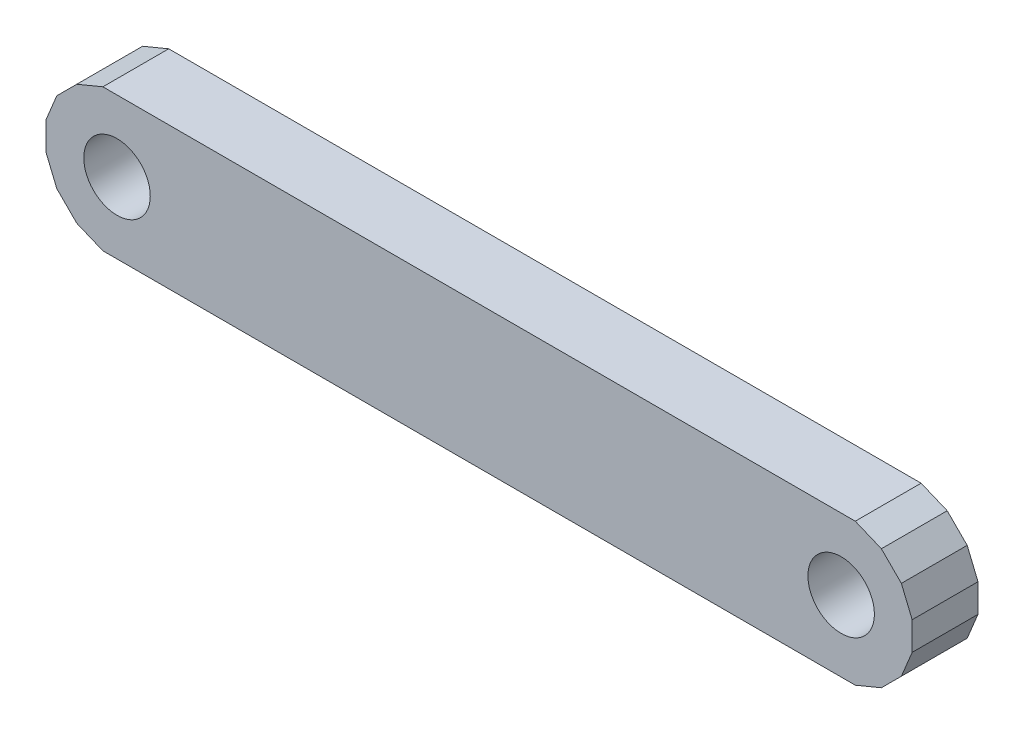
ISO-10303-21;
HEADER;
FILE_DESCRIPTION(('STEP AP214'),'2;1');
FILE_NAME('part.step','',(''),(''),'','','');
FILE_SCHEMA(('AUTOMOTIVE_DESIGN { 1 0 10303 214 1 1 1 1 }'));
ENDSEC;
DATA;
#1=APPLICATION_CONTEXT('core data for automotive mechanical design processes');
#2=APPLICATION_PROTOCOL_DEFINITION('international standard','automotive_design',2000,#1);
#3=PRODUCT_CONTEXT('',#1,'mechanical');
#4=PRODUCT('Part','Part','',(#3));
#5=PRODUCT_RELATED_PRODUCT_CATEGORY('part','',(#4));
#6=PRODUCT_DEFINITION_FORMATION('','',#4);
#7=PRODUCT_DEFINITION_CONTEXT('part definition',#1,'design');
#8=PRODUCT_DEFINITION('design','',#6,#7);
#9=PRODUCT_DEFINITION_SHAPE('','',#8);
#10=(LENGTH_UNIT() NAMED_UNIT(*) SI_UNIT(.MILLI.,.METRE.));
#11=(NAMED_UNIT(*) PLANE_ANGLE_UNIT() SI_UNIT($,.RADIAN.));
#12=(NAMED_UNIT(*) SI_UNIT($,.STERADIAN.) SOLID_ANGLE_UNIT());
#13=UNCERTAINTY_MEASURE_WITH_UNIT(LENGTH_MEASURE(1.E-05),#10,'distance_accuracy_value','');
#14=(GEOMETRIC_REPRESENTATION_CONTEXT(3) GLOBAL_UNCERTAINTY_ASSIGNED_CONTEXT((#13)) GLOBAL_UNIT_ASSIGNED_CONTEXT((#10,
#11,#12)) REPRESENTATION_CONTEXT('',''));
#15=CARTESIAN_POINT('',(0.,0.,0.));
#16=DIRECTION('',(0.,0.,1.));
#17=DIRECTION('',(1.,0.,0.));
#18=AXIS2_PLACEMENT_3D('',#15,#16,#17);
#19=CARTESIAN_POINT('',(0.,0.,18.));
#20=DIRECTION('',(0.,0.,1.));
#21=DIRECTION('',(1.,0.,0.));
#22=AXIS2_PLACEMENT_3D('',#19,#20,#21);
#23=PLANE('',#22);
#24=CARTESIAN_POINT('',(0.,0.,18.));
#25=DIRECTION('',(0.,0.,1.));
#26=DIRECTION('',(1.,0.,0.));
#27=AXIS2_PLACEMENT_3D('',#24,#25,#26);
#28=CIRCLE('',#27,5.05);
#29=CARTESIAN_POINT('',(5.05,0.,18.));
#30=VERTEX_POINT('',#29);
#31=EDGE_CURVE('E192',#30,#30,#28,.T.);
#32=ORIENTED_EDGE('',*,*,#31,.F.);
#33=EDGE_LOOP('',(#32));
#34=FACE_BOUND('',#33,.T.);
#35=DIRECTION('',(-0.382683432365089,0.923879532511287,0.));
#36=VECTOR('',#35,1.);
#37=CARTESIAN_POINT('',(10.7886380844355,2.14599354217741,18.));
#38=LINE('',#37,#36);
#39=CARTESIAN_POINT('',(10.7886380844355,2.14599354217741,18.));
#40=VERTEX_POINT('',#39);
#41=CARTESIAN_POINT('',(9.146165735328,6.11127256321562,18.));
#42=VERTEX_POINT('',#41);
#43=EDGE_CURVE('E219',#40,#42,#38,.T.);
#44=ORIENTED_EDGE('',*,*,#43,.T.);
#45=DIRECTION('',(-0.707106781186548,0.707106781186547,0.));
#46=VECTOR('',#45,1.);
#47=CARTESIAN_POINT('',(9.146165735328,6.11127256321562,18.));
#48=LINE('',#47,#46);
#49=CARTESIAN_POINT('',(6.11127256321562,9.146165735328,18.));
#50=VERTEX_POINT('',#49);
#51=EDGE_CURVE('E127',#42,#50,#48,.T.);
#52=ORIENTED_EDGE('',*,*,#51,.T.);
#53=DIRECTION('',(-0.923879532511287,0.38268343236509,0.));
#54=VECTOR('',#53,1.);
#55=CARTESIAN_POINT('',(6.11127256321562,9.146165735328,18.));
#56=LINE('',#55,#54);
#57=CARTESIAN_POINT('',(2.14599354217741,10.7886380844355,18.));
#58=VERTEX_POINT('',#57);
#59=EDGE_CURVE('E258',#50,#58,#56,.T.);
#60=ORIENTED_EDGE('',*,*,#59,.T.);
#61=DIRECTION('',(-1.,0.,0.));
#62=VECTOR('',#61,1.);
#63=CARTESIAN_POINT('',(2.14599354217741,10.7886380844355,18.));
#64=LINE('',#63,#62);
#65=CARTESIAN_POINT('',(-112.145993542177,10.7886380844355,18.));
#66=VERTEX_POINT('',#65);
#67=EDGE_CURVE('E277',#58,#66,#64,.T.);
#68=ORIENTED_EDGE('',*,*,#67,.T.);
#69=DIRECTION('',(-0.923879532511286,-0.382683432365091,0.));
#70=VECTOR('',#69,1.);
#71=CARTESIAN_POINT('',(-112.145993542177,10.7886380844355,18.));
#72=LINE('',#71,#70);
#73=CARTESIAN_POINT('',(-116.111272563216,9.146165735328,18.));
#74=VERTEX_POINT('',#73);
#75=EDGE_CURVE('E274',#66,#74,#72,.T.);
#76=ORIENTED_EDGE('',*,*,#75,.T.);
#77=DIRECTION('',(-0.707106781186548,-0.707106781186547,0.));
#78=VECTOR('',#77,1.);
#79=CARTESIAN_POINT('',(-116.111272563216,9.146165735328,18.));
#80=LINE('',#79,#78);
#81=CARTESIAN_POINT('',(-119.146165735328,6.11127256321562,18.));
#82=VERTEX_POINT('',#81);
#83=EDGE_CURVE('E276',#74,#82,#80,.T.);
#84=ORIENTED_EDGE('',*,*,#83,.T.);
#85=DIRECTION('',(-0.38268343236509,-0.923879532511286,0.));
#86=VECTOR('',#85,1.);
#87=CARTESIAN_POINT('',(-119.146165735328,6.11127256321562,18.));
#88=LINE('',#87,#86);
#89=CARTESIAN_POINT('',(-120.788638084436,2.14599354217741,18.));
#90=VERTEX_POINT('',#89);
#91=EDGE_CURVE('E279',#82,#90,#88,.T.);
#92=ORIENTED_EDGE('',*,*,#91,.T.);
#93=DIRECTION('',(0.,-1.,0.));
#94=VECTOR('',#93,1.);
#95=CARTESIAN_POINT('',(-120.788638084436,2.14599354217741,18.));
#96=LINE('',#95,#94);
#97=CARTESIAN_POINT('',(-120.788638084436,-2.14599354217742,18.));
#98=VERTEX_POINT('',#97);
#99=EDGE_CURVE('E285',#90,#98,#96,.T.);
#100=ORIENTED_EDGE('',*,*,#99,.T.);
#101=DIRECTION('',(0.382683432365091,-0.923879532511286,0.));
#102=VECTOR('',#101,1.);
#103=CARTESIAN_POINT('',(-120.788638084436,-2.14599354217742,18.));
#104=LINE('',#103,#102);
#105=CARTESIAN_POINT('',(-119.146165735328,-6.11127256321562,18.));
#106=VERTEX_POINT('',#105);
#107=EDGE_CURVE('E287',#98,#106,#104,.T.);
#108=ORIENTED_EDGE('',*,*,#107,.T.);
#109=DIRECTION('',(0.707106781186548,-0.707106781186547,0.));
#110=VECTOR('',#109,1.);
#111=CARTESIAN_POINT('',(-119.146165735328,-6.11127256321562,18.));
#112=LINE('',#111,#110);
#113=CARTESIAN_POINT('',(-116.111272563216,-9.146165735328,18.));
#114=VERTEX_POINT('',#113);
#115=EDGE_CURVE('E289',#106,#114,#112,.T.);
#116=ORIENTED_EDGE('',*,*,#115,.T.);
#117=DIRECTION('',(0.923879532511287,-0.38268343236509,0.));
#118=VECTOR('',#117,1.);
#119=CARTESIAN_POINT('',(-116.111272563216,-9.146165735328,18.));
#120=LINE('',#119,#118);
#121=CARTESIAN_POINT('',(-112.145993542177,-10.7886380844355,18.));
#122=VERTEX_POINT('',#121);
#123=EDGE_CURVE('E291',#114,#122,#120,.T.);
#124=ORIENTED_EDGE('',*,*,#123,.T.);
#125=DIRECTION('',(1.,0.,0.));
#126=VECTOR('',#125,1.);
#127=CARTESIAN_POINT('',(-112.145993542177,-10.7886380844355,18.));
#128=LINE('',#127,#126);
#129=CARTESIAN_POINT('',(2.14599354217742,-10.7886380844355,18.));
#130=VERTEX_POINT('',#129);
#131=EDGE_CURVE('E293',#122,#130,#128,.T.);
#132=ORIENTED_EDGE('',*,*,#131,.T.);
#133=DIRECTION('',(0.923879532511287,0.38268343236509,0.));
#134=VECTOR('',#133,1.);
#135=CARTESIAN_POINT('',(2.14599354217742,-10.7886380844355,18.));
#136=LINE('',#135,#134);
#137=CARTESIAN_POINT('',(6.11127256321562,-9.146165735328,18.));
#138=VERTEX_POINT('',#137);
#139=EDGE_CURVE('E170',#130,#138,#136,.T.);
#140=ORIENTED_EDGE('',*,*,#139,.T.);
#141=DIRECTION('',(0.707106781186548,0.707106781186547,0.));
#142=VECTOR('',#141,1.);
#143=CARTESIAN_POINT('',(6.11127256321562,-9.146165735328,18.));
#144=LINE('',#143,#142);
#145=CARTESIAN_POINT('',(9.146165735328,-6.11127256321562,18.));
#146=VERTEX_POINT('',#145);
#147=EDGE_CURVE('E164',#138,#146,#144,.T.);
#148=ORIENTED_EDGE('',*,*,#147,.T.);
#149=DIRECTION('',(0.38268343236509,0.923879532511287,0.));
#150=VECTOR('',#149,1.);
#151=CARTESIAN_POINT('',(9.146165735328,-6.11127256321562,18.));
#152=LINE('',#151,#150);
#153=CARTESIAN_POINT('',(10.7886380844355,-2.14599354217741,18.));
#154=VERTEX_POINT('',#153);
#155=EDGE_CURVE('E168',#146,#154,#152,.T.);
#156=ORIENTED_EDGE('',*,*,#155,.T.);
#157=DIRECTION('',(0.,1.,0.));
#158=VECTOR('',#157,1.);
#159=CARTESIAN_POINT('',(10.7886380844355,-2.14599354217741,18.));
#160=LINE('',#159,#158);
#161=EDGE_CURVE('E60',#154,#40,#160,.T.);
#162=ORIENTED_EDGE('',*,*,#161,.T.);
#163=EDGE_LOOP('',(#44,#52,#60,#68,#76,#84,#92,#100,#108,#116,#124,#132,#140,#148,#156,#162));
#164=FACE_BOUND('',#163,.T.);
#165=CARTESIAN_POINT('',(-110.,0.,18.));
#166=DIRECTION('',(0.,0.,1.));
#167=DIRECTION('',(1.,0.,0.));
#168=AXIS2_PLACEMENT_3D('',#165,#166,#167);
#169=CIRCLE('',#168,5.05);
#170=CARTESIAN_POINT('',(-104.95,0.,18.));
#171=VERTEX_POINT('',#170);
#172=EDGE_CURVE('E335',#171,#171,#169,.T.);
#173=ORIENTED_EDGE('',*,*,#172,.F.);
#174=EDGE_LOOP('',(#173));
#175=FACE_BOUND('',#174,.T.);
#176=ADVANCED_FACE('F43',(#34,#164,#175),#23,.T.);
#177=CARTESIAN_POINT('',(0.,0.,8.));
#178=DIRECTION('',(0.,0.,1.));
#179=DIRECTION('',(1.,0.,0.));
#180=AXIS2_PLACEMENT_3D('',#177,#178,#179);
#181=PLANE('',#180);
#182=DIRECTION('',(-0.382683432365089,0.923879532511287,0.));
#183=VECTOR('',#182,1.);
#184=CARTESIAN_POINT('',(10.7886380844355,2.14599354217741,8.));
#185=LINE('',#184,#183);
#186=CARTESIAN_POINT('',(10.7886380844355,2.14599354217741,8.));
#187=VERTEX_POINT('',#186);
#188=CARTESIAN_POINT('',(9.146165735328,6.11127256321562,8.));
#189=VERTEX_POINT('',#188);
#190=EDGE_CURVE('E188',#187,#189,#185,.T.);
#191=ORIENTED_EDGE('',*,*,#190,.F.);
#192=DIRECTION('',(0.,1.,0.));
#193=VECTOR('',#192,1.);
#194=CARTESIAN_POINT('',(10.7886380844355,-2.14599354217741,8.));
#195=LINE('',#194,#193);
#196=CARTESIAN_POINT('',(10.7886380844355,-2.14599354217741,8.));
#197=VERTEX_POINT('',#196);
#198=EDGE_CURVE('E119',#197,#187,#195,.T.);
#199=ORIENTED_EDGE('',*,*,#198,.F.);
#200=DIRECTION('',(0.38268343236509,0.923879532511287,0.));
#201=VECTOR('',#200,1.);
#202=CARTESIAN_POINT('',(9.146165735328,-6.11127256321562,8.));
#203=LINE('',#202,#201);
#204=CARTESIAN_POINT('',(9.146165735328,-6.11127256321562,8.));
#205=VERTEX_POINT('',#204);
#206=EDGE_CURVE('E113',#205,#197,#203,.T.);
#207=ORIENTED_EDGE('',*,*,#206,.F.);
#208=DIRECTION('',(0.707106781186548,0.707106781186547,0.));
#209=VECTOR('',#208,1.);
#210=CARTESIAN_POINT('',(6.11127256321562,-9.146165735328,8.));
#211=LINE('',#210,#209);
#212=CARTESIAN_POINT('',(6.11127256321562,-9.146165735328,8.));
#213=VERTEX_POINT('',#212);
#214=EDGE_CURVE('E178',#213,#205,#211,.T.);
#215=ORIENTED_EDGE('',*,*,#214,.F.);
#216=DIRECTION('',(0.923879532511287,0.38268343236509,0.));
#217=VECTOR('',#216,1.);
#218=CARTESIAN_POINT('',(2.14599354217742,-10.7886380844355,8.));
#219=LINE('',#218,#217);
#220=CARTESIAN_POINT('',(2.14599354217742,-10.7886380844355,8.));
#221=VERTEX_POINT('',#220);
#222=EDGE_CURVE('E214',#221,#213,#219,.T.);
#223=ORIENTED_EDGE('',*,*,#222,.F.);
#224=DIRECTION('',(1.,0.,0.));
#225=VECTOR('',#224,1.);
#226=CARTESIAN_POINT('',(-112.145993542177,-10.7886380844355,8.));
#227=LINE('',#226,#225);
#228=CARTESIAN_POINT('',(-112.145993542177,-10.7886380844355,8.));
#229=VERTEX_POINT('',#228);
#230=EDGE_CURVE('E212',#229,#221,#227,.T.);
#231=ORIENTED_EDGE('',*,*,#230,.F.);
#232=DIRECTION('',(0.923879532511287,-0.38268343236509,0.));
#233=VECTOR('',#232,1.);
#234=CARTESIAN_POINT('',(-116.111272563216,-9.146165735328,8.));
#235=LINE('',#234,#233);
#236=CARTESIAN_POINT('',(-116.111272563216,-9.146165735328,8.));
#237=VERTEX_POINT('',#236);
#238=EDGE_CURVE('E210',#237,#229,#235,.T.);
#239=ORIENTED_EDGE('',*,*,#238,.F.);
#240=DIRECTION('',(0.707106781186548,-0.707106781186547,0.));
#241=VECTOR('',#240,1.);
#242=CARTESIAN_POINT('',(-119.146165735328,-6.11127256321562,8.));
#243=LINE('',#242,#241);
#244=CARTESIAN_POINT('',(-119.146165735328,-6.11127256321562,8.));
#245=VERTEX_POINT('',#244);
#246=EDGE_CURVE('E208',#245,#237,#243,.T.);
#247=ORIENTED_EDGE('',*,*,#246,.F.);
#248=DIRECTION('',(0.382683432365091,-0.923879532511286,0.));
#249=VECTOR('',#248,1.);
#250=CARTESIAN_POINT('',(-120.788638084436,-2.14599354217742,8.));
#251=LINE('',#250,#249);
#252=CARTESIAN_POINT('',(-120.788638084436,-2.14599354217742,8.));
#253=VERTEX_POINT('',#252);
#254=EDGE_CURVE('E206',#253,#245,#251,.T.);
#255=ORIENTED_EDGE('',*,*,#254,.F.);
#256=DIRECTION('',(0.,-1.,0.));
#257=VECTOR('',#256,1.);
#258=CARTESIAN_POINT('',(-120.788638084436,2.14599354217741,8.));
#259=LINE('',#258,#257);
#260=CARTESIAN_POINT('',(-120.788638084436,2.14599354217741,8.));
#261=VERTEX_POINT('',#260);
#262=EDGE_CURVE('E204',#261,#253,#259,.T.);
#263=ORIENTED_EDGE('',*,*,#262,.F.);
#264=DIRECTION('',(-0.38268343236509,-0.923879532511286,0.));
#265=VECTOR('',#264,1.);
#266=CARTESIAN_POINT('',(-119.146165735328,6.11127256321562,8.));
#267=LINE('',#266,#265);
#268=CARTESIAN_POINT('',(-119.146165735328,6.11127256321562,8.));
#269=VERTEX_POINT('',#268);
#270=EDGE_CURVE('E202',#269,#261,#267,.T.);
#271=ORIENTED_EDGE('',*,*,#270,.F.);
#272=DIRECTION('',(-0.707106781186548,-0.707106781186547,0.));
#273=VECTOR('',#272,1.);
#274=CARTESIAN_POINT('',(-116.111272563216,9.146165735328,8.));
#275=LINE('',#274,#273);
#276=CARTESIAN_POINT('',(-116.111272563216,9.146165735328,8.));
#277=VERTEX_POINT('',#276);
#278=EDGE_CURVE('E200',#277,#269,#275,.T.);
#279=ORIENTED_EDGE('',*,*,#278,.F.);
#280=DIRECTION('',(-0.923879532511286,-0.382683432365091,0.));
#281=VECTOR('',#280,1.);
#282=CARTESIAN_POINT('',(-112.145993542177,10.7886380844355,8.));
#283=LINE('',#282,#281);
#284=CARTESIAN_POINT('',(-112.145993542177,10.7886380844355,8.));
#285=VERTEX_POINT('',#284);
#286=EDGE_CURVE('E198',#285,#277,#283,.T.);
#287=ORIENTED_EDGE('',*,*,#286,.F.);
#288=DIRECTION('',(-1.,0.,0.));
#289=VECTOR('',#288,1.);
#290=CARTESIAN_POINT('',(2.14599354217741,10.7886380844355,8.));
#291=LINE('',#290,#289);
#292=CARTESIAN_POINT('',(2.14599354217741,10.7886380844355,8.));
#293=VERTEX_POINT('',#292);
#294=EDGE_CURVE('E196',#293,#285,#291,.T.);
#295=ORIENTED_EDGE('',*,*,#294,.F.);
#296=DIRECTION('',(-0.923879532511287,0.38268343236509,0.));
#297=VECTOR('',#296,1.);
#298=CARTESIAN_POINT('',(6.11127256321562,9.146165735328,8.));
#299=LINE('',#298,#297);
#300=CARTESIAN_POINT('',(6.11127256321562,9.146165735328,8.));
#301=VERTEX_POINT('',#300);
#302=EDGE_CURVE('E194',#301,#293,#299,.T.);
#303=ORIENTED_EDGE('',*,*,#302,.F.);
#304=DIRECTION('',(-0.707106781186548,0.707106781186547,0.));
#305=VECTOR('',#304,1.);
#306=CARTESIAN_POINT('',(9.146165735328,6.11127256321562,8.));
#307=LINE('',#306,#305);
#308=EDGE_CURVE('E191',#189,#301,#307,.T.);
#309=ORIENTED_EDGE('',*,*,#308,.F.);
#310=EDGE_LOOP('',(#191,#199,#207,#215,#223,#231,#239,#247,#255,#263,#271,#279,#287,#295,#303,#309));
#311=FACE_BOUND('',#310,.T.);
#312=CARTESIAN_POINT('',(0.,0.,8.));
#313=DIRECTION('',(0.,0.,1.));
#314=DIRECTION('',(1.,0.,0.));
#315=AXIS2_PLACEMENT_3D('',#312,#313,#314);
#316=CIRCLE('',#315,5.05);
#317=CARTESIAN_POINT('',(5.05,0.,8.));
#318=VERTEX_POINT('',#317);
#319=EDGE_CURVE('E341',#318,#318,#316,.T.);
#320=ORIENTED_EDGE('',*,*,#319,.T.);
#321=EDGE_LOOP('',(#320));
#322=FACE_BOUND('',#321,.T.);
#323=CARTESIAN_POINT('',(-110.,0.,8.));
#324=DIRECTION('',(0.,0.,1.));
#325=DIRECTION('',(1.,0.,0.));
#326=AXIS2_PLACEMENT_3D('',#323,#324,#325);
#327=CIRCLE('',#326,5.05);
#328=CARTESIAN_POINT('',(-104.95,0.,8.));
#329=VERTEX_POINT('',#328);
#330=EDGE_CURVE('E338',#329,#329,#327,.T.);
#331=ORIENTED_EDGE('',*,*,#330,.T.);
#332=EDGE_LOOP('',(#331));
#333=FACE_BOUND('',#332,.T.);
#334=ADVANCED_FACE('F262',(#311,#322,#333),#181,.F.);
#335=CARTESIAN_POINT('',(10.7886380844355,2.14599354217741,18.));
#336=DIRECTION('',(-0.923879532511287,-0.382683432365089,0.));
#337=DIRECTION('',(0.382683432365089,-0.923879532511287,0.));
#338=AXIS2_PLACEMENT_3D('',#335,#336,#337);
#339=PLANE('',#338);
#340=ORIENTED_EDGE('',*,*,#190,.T.);
#341=DIRECTION('',(0.,0.,-1.));
#342=VECTOR('',#341,1.);
#343=CARTESIAN_POINT('',(9.146165735328,6.11127256321562,18.));
#344=LINE('',#343,#342);
#345=EDGE_CURVE('E11',#42,#189,#344,.T.);
#346=ORIENTED_EDGE('',*,*,#345,.F.);
#347=ORIENTED_EDGE('',*,*,#43,.F.);
#348=DIRECTION('',(0.,0.,-1.));
#349=VECTOR('',#348,1.);
#350=CARTESIAN_POINT('',(10.7886380844355,2.14599354217741,18.));
#351=LINE('',#350,#349);
#352=EDGE_CURVE('E184',#40,#187,#351,.T.);
#353=ORIENTED_EDGE('',*,*,#352,.T.);
#354=EDGE_LOOP('',(#340,#346,#347,#353));
#355=FACE_BOUND('',#354,.T.);
#356=ADVANCED_FACE('F45',(#355),#339,.F.);
#357=CARTESIAN_POINT('',(9.146165735328,6.11127256321562,18.));
#358=DIRECTION('',(-0.707106781186547,-0.707106781186548,0.));
#359=DIRECTION('',(0.707106781186548,-0.707106781186547,0.));
#360=AXIS2_PLACEMENT_3D('',#357,#358,#359);
#361=PLANE('',#360);
#362=ORIENTED_EDGE('',*,*,#308,.T.);
#363=DIRECTION('',(0.,0.,-1.));
#364=VECTOR('',#363,1.);
#365=CARTESIAN_POINT('',(6.11127256321562,9.146165735328,18.));
#366=LINE('',#365,#364);
#367=EDGE_CURVE('E52',#50,#301,#366,.T.);
#368=ORIENTED_EDGE('',*,*,#367,.F.);
#369=ORIENTED_EDGE('',*,*,#51,.F.);
#370=ORIENTED_EDGE('',*,*,#345,.T.);
#371=EDGE_LOOP('',(#362,#368,#369,#370));
#372=FACE_BOUND('',#371,.T.);
#373=ADVANCED_FACE('F476',(#372),#361,.F.);
#374=CARTESIAN_POINT('',(6.11127256321562,9.146165735328,18.));
#375=DIRECTION('',(-0.38268343236509,-0.923879532511287,0.));
#376=DIRECTION('',(0.923879532511287,-0.38268343236509,0.));
#377=AXIS2_PLACEMENT_3D('',#374,#375,#376);
#378=PLANE('',#377);
#379=ORIENTED_EDGE('',*,*,#302,.T.);
#380=DIRECTION('',(0.,0.,-1.));
#381=VECTOR('',#380,1.);
#382=CARTESIAN_POINT('',(2.14599354217741,10.7886380844355,18.));
#383=LINE('',#382,#381);
#384=EDGE_CURVE('E250',#58,#293,#383,.T.);
#385=ORIENTED_EDGE('',*,*,#384,.F.);
#386=ORIENTED_EDGE('',*,*,#59,.F.);
#387=ORIENTED_EDGE('',*,*,#367,.T.);
#388=EDGE_LOOP('',(#379,#385,#386,#387));
#389=FACE_BOUND('',#388,.T.);
#390=ADVANCED_FACE('F256',(#389),#378,.F.);
#391=CARTESIAN_POINT('',(2.14599354217741,10.7886380844355,18.));
#392=DIRECTION('',(0.,-1.,0.));
#393=DIRECTION('',(0.,0.,-1.));
#394=AXIS2_PLACEMENT_3D('',#391,#392,#393);
#395=PLANE('',#394);
#396=ORIENTED_EDGE('',*,*,#294,.T.);
#397=DIRECTION('',(0.,0.,-1.));
#398=VECTOR('',#397,1.);
#399=CARTESIAN_POINT('',(-112.145993542177,10.7886380844355,18.));
#400=LINE('',#399,#398);
#401=EDGE_CURVE('E247',#66,#285,#400,.T.);
#402=ORIENTED_EDGE('',*,*,#401,.F.);
#403=ORIENTED_EDGE('',*,*,#67,.F.);
#404=ORIENTED_EDGE('',*,*,#384,.T.);
#405=EDGE_LOOP('',(#396,#402,#403,#404));
#406=FACE_BOUND('',#405,.T.);
#407=ADVANCED_FACE('F268',(#406),#395,.F.);
#408=CARTESIAN_POINT('',(-112.145993542177,10.7886380844355,18.));
#409=DIRECTION('',(0.382683432365091,-0.923879532511287,0.));
#410=DIRECTION('',(0.923879532511287,0.382683432365091,0.));
#411=AXIS2_PLACEMENT_3D('',#408,#409,#410);
#412=PLANE('',#411);
#413=ORIENTED_EDGE('',*,*,#286,.T.);
#414=DIRECTION('',(0.,0.,-1.));
#415=VECTOR('',#414,1.);
#416=CARTESIAN_POINT('',(-116.111272563216,9.146165735328,18.));
#417=LINE('',#416,#415);
#418=EDGE_CURVE('E244',#74,#277,#417,.T.);
#419=ORIENTED_EDGE('',*,*,#418,.F.);
#420=ORIENTED_EDGE('',*,*,#75,.F.);
#421=ORIENTED_EDGE('',*,*,#401,.T.);
#422=EDGE_LOOP('',(#413,#419,#420,#421));
#423=FACE_BOUND('',#422,.T.);
#424=ADVANCED_FACE('F272',(#423),#412,.F.);
#425=CARTESIAN_POINT('',(-116.111272563216,9.146165735328,18.));
#426=DIRECTION('',(0.707106781186547,-0.707106781186548,0.));
#427=DIRECTION('',(0.707106781186548,0.707106781186547,0.));
#428=AXIS2_PLACEMENT_3D('',#425,#426,#427);
#429=PLANE('',#428);
#430=ORIENTED_EDGE('',*,*,#278,.T.);
#431=DIRECTION('',(0.,0.,-1.));
#432=VECTOR('',#431,1.);
#433=CARTESIAN_POINT('',(-119.146165735328,6.11127256321562,18.));
#434=LINE('',#433,#432);
#435=EDGE_CURVE('E241',#82,#269,#434,.T.);
#436=ORIENTED_EDGE('',*,*,#435,.F.);
#437=ORIENTED_EDGE('',*,*,#83,.F.);
#438=ORIENTED_EDGE('',*,*,#418,.T.);
#439=EDGE_LOOP('',(#430,#436,#437,#438));
#440=FACE_BOUND('',#439,.T.);
#441=ADVANCED_FACE('F441',(#440),#429,.F.);
#442=CARTESIAN_POINT('',(-119.146165735328,6.11127256321562,18.));
#443=DIRECTION('',(0.923879532511287,-0.38268343236509,0.));
#444=DIRECTION('',(0.38268343236509,0.923879532511287,0.));
#445=AXIS2_PLACEMENT_3D('',#442,#443,#444);
#446=PLANE('',#445);
#447=ORIENTED_EDGE('',*,*,#270,.T.);
#448=DIRECTION('',(0.,0.,-1.));
#449=VECTOR('',#448,1.);
#450=CARTESIAN_POINT('',(-120.788638084436,2.14599354217741,18.));
#451=LINE('',#450,#449);
#452=EDGE_CURVE('E238',#90,#261,#451,.T.);
#453=ORIENTED_EDGE('',*,*,#452,.F.);
#454=ORIENTED_EDGE('',*,*,#91,.F.);
#455=ORIENTED_EDGE('',*,*,#435,.T.);
#456=EDGE_LOOP('',(#447,#453,#454,#455));
#457=FACE_BOUND('',#456,.T.);
#458=ADVANCED_FACE('F431',(#457),#446,.F.);
#459=CARTESIAN_POINT('',(-120.788638084436,2.14599354217741,18.));
#460=DIRECTION('',(1.,0.,0.));
#461=DIRECTION('',(0.,0.,-1.));
#462=AXIS2_PLACEMENT_3D('',#459,#460,#461);
#463=PLANE('',#462);
#464=ORIENTED_EDGE('',*,*,#262,.T.);
#465=DIRECTION('',(0.,0.,-1.));
#466=VECTOR('',#465,1.);
#467=CARTESIAN_POINT('',(-120.788638084436,-2.14599354217742,18.));
#468=LINE('',#467,#466);
#469=EDGE_CURVE('E235',#98,#253,#468,.T.);
#470=ORIENTED_EDGE('',*,*,#469,.F.);
#471=ORIENTED_EDGE('',*,*,#99,.F.);
#472=ORIENTED_EDGE('',*,*,#452,.T.);
#473=EDGE_LOOP('',(#464,#470,#471,#472));
#474=FACE_BOUND('',#473,.T.);
#475=ADVANCED_FACE('F421',(#474),#463,.F.);
#476=CARTESIAN_POINT('',(-120.788638084436,-2.14599354217742,18.));
#477=DIRECTION('',(0.923879532511286,0.382683432365091,0.));
#478=DIRECTION('',(-0.382683432365091,0.923879532511286,0.));
#479=AXIS2_PLACEMENT_3D('',#476,#477,#478);
#480=PLANE('',#479);
#481=ORIENTED_EDGE('',*,*,#254,.T.);
#482=DIRECTION('',(0.,0.,-1.));
#483=VECTOR('',#482,1.);
#484=CARTESIAN_POINT('',(-119.146165735328,-6.11127256321562,18.));
#485=LINE('',#484,#483);
#486=EDGE_CURVE('E232',#106,#245,#485,.T.);
#487=ORIENTED_EDGE('',*,*,#486,.F.);
#488=ORIENTED_EDGE('',*,*,#107,.F.);
#489=ORIENTED_EDGE('',*,*,#469,.T.);
#490=EDGE_LOOP('',(#481,#487,#488,#489));
#491=FACE_BOUND('',#490,.T.);
#492=ADVANCED_FACE('F411',(#491),#480,.F.);
#493=CARTESIAN_POINT('',(-119.146165735328,-6.11127256321562,18.));
#494=DIRECTION('',(0.707106781186547,0.707106781186548,0.));
#495=DIRECTION('',(-0.707106781186548,0.707106781186547,0.));
#496=AXIS2_PLACEMENT_3D('',#493,#494,#495);
#497=PLANE('',#496);
#498=ORIENTED_EDGE('',*,*,#246,.T.);
#499=DIRECTION('',(0.,0.,-1.));
#500=VECTOR('',#499,1.);
#501=CARTESIAN_POINT('',(-116.111272563216,-9.146165735328,18.));
#502=LINE('',#501,#500);
#503=EDGE_CURVE('E229',#114,#237,#502,.T.);
#504=ORIENTED_EDGE('',*,*,#503,.F.);
#505=ORIENTED_EDGE('',*,*,#115,.F.);
#506=ORIENTED_EDGE('',*,*,#486,.T.);
#507=EDGE_LOOP('',(#498,#504,#505,#506));
#508=FACE_BOUND('',#507,.T.);
#509=ADVANCED_FACE('F401',(#508),#497,.F.);
#510=CARTESIAN_POINT('',(-116.111272563216,-9.146165735328,18.));
#511=DIRECTION('',(0.38268343236509,0.923879532511287,0.));
#512=DIRECTION('',(-0.923879532511287,0.38268343236509,0.));
#513=AXIS2_PLACEMENT_3D('',#510,#511,#512);
#514=PLANE('',#513);
#515=ORIENTED_EDGE('',*,*,#238,.T.);
#516=DIRECTION('',(0.,0.,-1.));
#517=VECTOR('',#516,1.);
#518=CARTESIAN_POINT('',(-112.145993542177,-10.7886380844355,18.));
#519=LINE('',#518,#517);
#520=EDGE_CURVE('E226',#122,#229,#519,.T.);
#521=ORIENTED_EDGE('',*,*,#520,.F.);
#522=ORIENTED_EDGE('',*,*,#123,.F.);
#523=ORIENTED_EDGE('',*,*,#503,.T.);
#524=EDGE_LOOP('',(#515,#521,#522,#523));
#525=FACE_BOUND('',#524,.T.);
#526=ADVANCED_FACE('F392',(#525),#514,.F.);
#527=CARTESIAN_POINT('',(-112.145993542177,-10.7886380844355,18.));
#528=DIRECTION('',(0.,1.,0.));
#529=DIRECTION('',(-1.,0.,0.));
#530=AXIS2_PLACEMENT_3D('',#527,#528,#529);
#531=PLANE('',#530);
#532=ORIENTED_EDGE('',*,*,#230,.T.);
#533=DIRECTION('',(0.,0.,-1.));
#534=VECTOR('',#533,1.);
#535=CARTESIAN_POINT('',(2.14599354217742,-10.7886380844355,18.));
#536=LINE('',#535,#534);
#537=EDGE_CURVE('E223',#130,#221,#536,.T.);
#538=ORIENTED_EDGE('',*,*,#537,.F.);
#539=ORIENTED_EDGE('',*,*,#131,.F.);
#540=ORIENTED_EDGE('',*,*,#520,.T.);
#541=EDGE_LOOP('',(#532,#538,#539,#540));
#542=FACE_BOUND('',#541,.T.);
#543=ADVANCED_FACE('F299',(#542),#531,.F.);
#544=CARTESIAN_POINT('',(2.14599354217742,-10.7886380844355,18.));
#545=DIRECTION('',(-0.38268343236509,0.923879532511287,0.));
#546=DIRECTION('',(-0.923879532511287,-0.38268343236509,0.));
#547=AXIS2_PLACEMENT_3D('',#544,#545,#546);
#548=PLANE('',#547);
#549=ORIENTED_EDGE('',*,*,#222,.T.);
#550=DIRECTION('',(0.,0.,-1.));
#551=VECTOR('',#550,1.);
#552=CARTESIAN_POINT('',(6.11127256321562,-9.146165735328,18.));
#553=LINE('',#552,#551);
#554=EDGE_CURVE('E179',#138,#213,#553,.T.);
#555=ORIENTED_EDGE('',*,*,#554,.F.);
#556=ORIENTED_EDGE('',*,*,#139,.F.);
#557=ORIENTED_EDGE('',*,*,#537,.T.);
#558=EDGE_LOOP('',(#549,#555,#556,#557));
#559=FACE_BOUND('',#558,.T.);
#560=ADVANCED_FACE('F303',(#559),#548,.F.);
#561=CARTESIAN_POINT('',(6.11127256321562,-9.146165735328,18.));
#562=DIRECTION('',(-0.707106781186547,0.707106781186548,0.));
#563=DIRECTION('',(-0.707106781186548,-0.707106781186547,0.));
#564=AXIS2_PLACEMENT_3D('',#561,#562,#563);
#565=PLANE('',#564);
#566=ORIENTED_EDGE('',*,*,#214,.T.);
#567=DIRECTION('',(0.,0.,-1.));
#568=VECTOR('',#567,1.);
#569=CARTESIAN_POINT('',(9.146165735328,-6.11127256321562,18.));
#570=LINE('',#569,#568);
#571=EDGE_CURVE('E175',#146,#205,#570,.T.);
#572=ORIENTED_EDGE('',*,*,#571,.F.);
#573=ORIENTED_EDGE('',*,*,#147,.F.);
#574=ORIENTED_EDGE('',*,*,#554,.T.);
#575=EDGE_LOOP('',(#566,#572,#573,#574));
#576=FACE_BOUND('',#575,.T.);
#577=ADVANCED_FACE('F176',(#576),#565,.F.);
#578=CARTESIAN_POINT('',(9.146165735328,-6.11127256321562,18.));
#579=DIRECTION('',(-0.923879532511287,0.38268343236509,0.));
#580=DIRECTION('',(-0.38268343236509,-0.923879532511287,0.));
#581=AXIS2_PLACEMENT_3D('',#578,#579,#580);
#582=PLANE('',#581);
#583=ORIENTED_EDGE('',*,*,#206,.T.);
#584=DIRECTION('',(0.,0.,-1.));
#585=VECTOR('',#584,1.);
#586=CARTESIAN_POINT('',(10.7886380844355,-2.14599354217741,18.));
#587=LINE('',#586,#585);
#588=EDGE_CURVE('E180',#154,#197,#587,.T.);
#589=ORIENTED_EDGE('',*,*,#588,.F.);
#590=ORIENTED_EDGE('',*,*,#155,.F.);
#591=ORIENTED_EDGE('',*,*,#571,.T.);
#592=EDGE_LOOP('',(#583,#589,#590,#591));
#593=FACE_BOUND('',#592,.T.);
#594=ADVANCED_FACE('F182',(#593),#582,.F.);
#595=CARTESIAN_POINT('',(10.7886380844355,-2.14599354217741,18.));
#596=DIRECTION('',(-1.,0.,0.));
#597=DIRECTION('',(0.,0.,1.));
#598=AXIS2_PLACEMENT_3D('',#595,#596,#597);
#599=PLANE('',#598);
#600=ORIENTED_EDGE('',*,*,#198,.T.);
#601=ORIENTED_EDGE('',*,*,#352,.F.);
#602=ORIENTED_EDGE('',*,*,#161,.F.);
#603=ORIENTED_EDGE('',*,*,#588,.T.);
#604=EDGE_LOOP('',(#600,#601,#602,#603));
#605=FACE_BOUND('',#604,.T.);
#606=ADVANCED_FACE('F307',(#605),#599,.F.);
#607=CARTESIAN_POINT('',(0.,0.,18.));
#608=DIRECTION('',(0.,0.,-1.));
#609=DIRECTION('',(-1.,0.,0.));
#610=AXIS2_PLACEMENT_3D('',#607,#608,#609);
#611=CYLINDRICAL_SURFACE('',#610,5.05);
#612=ORIENTED_EDGE('',*,*,#31,.T.);
#613=EDGE_LOOP('',(#612));
#614=FACE_BOUND('',#613,.T.);
#615=ORIENTED_EDGE('',*,*,#319,.F.);
#616=EDGE_LOOP('',(#615));
#617=FACE_BOUND('',#616,.T.);
#618=ADVANCED_FACE('F309',(#614,#617),#611,.F.);
#619=CARTESIAN_POINT('',(-110.,0.,18.));
#620=DIRECTION('',(0.,0.,-1.));
#621=DIRECTION('',(-1.,0.,0.));
#622=AXIS2_PLACEMENT_3D('',#619,#620,#621);
#623=CYLINDRICAL_SURFACE('',#622,5.05);
#624=ORIENTED_EDGE('',*,*,#172,.T.);
#625=EDGE_LOOP('',(#624));
#626=FACE_BOUND('',#625,.T.);
#627=ORIENTED_EDGE('',*,*,#330,.F.);
#628=EDGE_LOOP('',(#627));
#629=FACE_BOUND('',#628,.T.);
#630=ADVANCED_FACE('F315',(#626,#629),#623,.F.);
#631=CLOSED_SHELL('',(#176,#334,#356,#373,#390,#407,#424,#441,#458,#475,#492,#509,#526,#543,
#560,#577,#594,#606,#618,#630));
#632=MANIFOLD_SOLID_BREP('B2',#631);
#633=ADVANCED_BREP_SHAPE_REPRESENTATION('',(#18,#632),#14);
#634=SHAPE_DEFINITION_REPRESENTATION(#9,#633);
ENDSEC;
END-ISO-10303-21;
